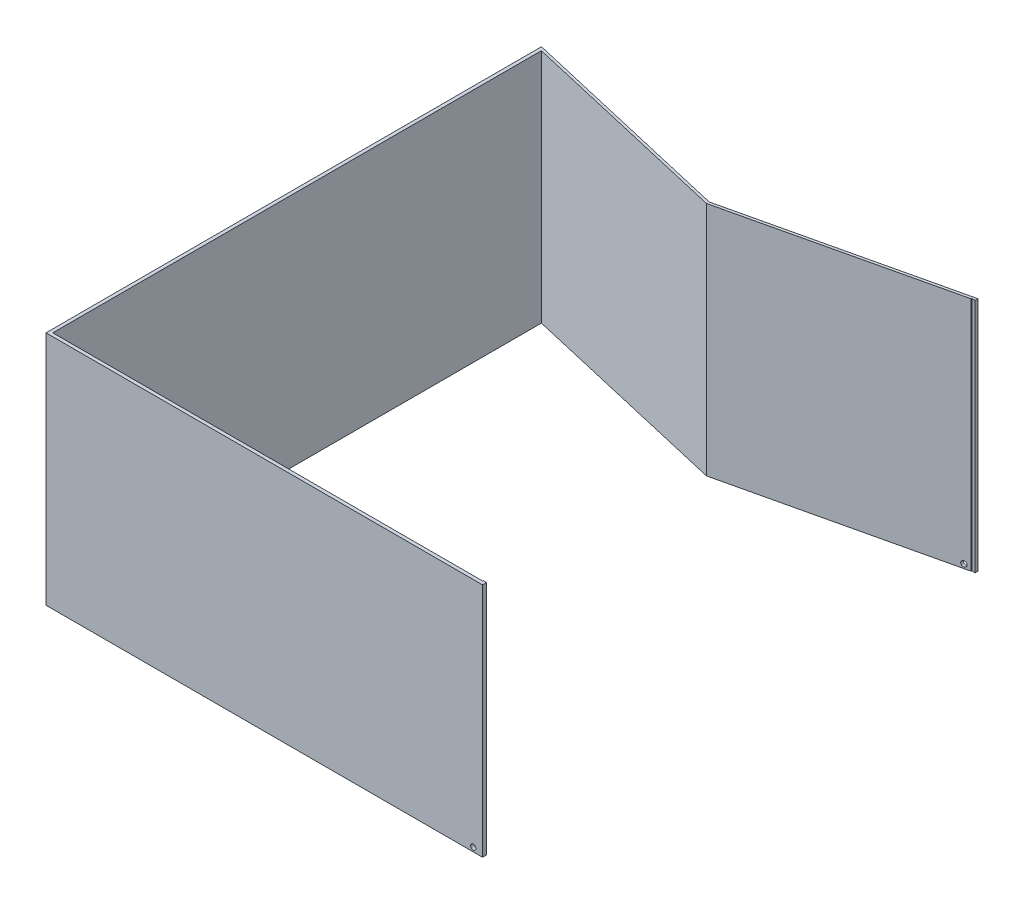
ISO-10303-21;
HEADER;
FILE_DESCRIPTION(('STEP AP214'),'2;1');
FILE_NAME('part.step','',(''),(''),'','','');
FILE_SCHEMA(('AUTOMOTIVE_DESIGN { 1 0 10303 214 1 1 1 1 }'));
ENDSEC;
DATA;
#1=APPLICATION_CONTEXT('core data for automotive mechanical design processes');
#2=APPLICATION_PROTOCOL_DEFINITION('international standard','automotive_design',2000,#1);
#3=PRODUCT_CONTEXT('',#1,'mechanical');
#4=PRODUCT('Part','Part','',(#3));
#5=PRODUCT_RELATED_PRODUCT_CATEGORY('part','',(#4));
#6=PRODUCT_DEFINITION_FORMATION('','',#4);
#7=PRODUCT_DEFINITION_CONTEXT('part definition',#1,'design');
#8=PRODUCT_DEFINITION('design','',#6,#7);
#9=PRODUCT_DEFINITION_SHAPE('','',#8);
#10=(LENGTH_UNIT() NAMED_UNIT(*) SI_UNIT(.MILLI.,.METRE.));
#11=(NAMED_UNIT(*) PLANE_ANGLE_UNIT() SI_UNIT($,.RADIAN.));
#12=(NAMED_UNIT(*) SI_UNIT($,.STERADIAN.) SOLID_ANGLE_UNIT());
#13=UNCERTAINTY_MEASURE_WITH_UNIT(LENGTH_MEASURE(1.E-05),#10,'distance_accuracy_value','');
#14=(GEOMETRIC_REPRESENTATION_CONTEXT(3) GLOBAL_UNCERTAINTY_ASSIGNED_CONTEXT((#13)) GLOBAL_UNIT_ASSIGNED_CONTEXT((#10,
#11,#12)) REPRESENTATION_CONTEXT('',''));
#15=CARTESIAN_POINT('',(0.,0.,0.));
#16=DIRECTION('',(0.,0.,1.));
#17=DIRECTION('',(1.,0.,0.));
#18=AXIS2_PLACEMENT_3D('',#15,#16,#17);
#19=CARTESIAN_POINT('',(328.93,355.6,373.38));
#20=DIRECTION('',(-1.,0.,0.));
#21=DIRECTION('',(0.,0.,1.));
#22=AXIS2_PLACEMENT_3D('',#19,#20,#21);
#23=PLANE('',#22);
#24=DIRECTION('',(0.,0.,-1.));
#25=VECTOR('',#24,1.);
#26=CARTESIAN_POINT('',(328.93,355.6,373.38));
#27=LINE('',#26,#25);
#28=CARTESIAN_POINT('',(328.93,355.6,-369.059218534318));
#29=VERTEX_POINT('',#28);
#30=CARTESIAN_POINT('',(328.93,355.6,-373.38));
#31=VERTEX_POINT('',#30);
#32=EDGE_CURVE('E213',#29,#31,#27,.T.);
#33=ORIENTED_EDGE('',*,*,#32,.F.);
#34=DIRECTION('',(0.,1.,0.));
#35=VECTOR('',#34,1.);
#36=CARTESIAN_POINT('',(328.93,0.,-369.059218534318));
#37=LINE('',#36,#35);
#38=CARTESIAN_POINT('',(328.93,0.,-369.059218534318));
#39=VERTEX_POINT('',#38);
#40=EDGE_CURVE('E149',#39,#29,#37,.T.);
#41=ORIENTED_EDGE('',*,*,#40,.F.);
#42=DIRECTION('',(0.,0.,-1.));
#43=VECTOR('',#42,1.);
#44=CARTESIAN_POINT('',(328.93,0.,373.38));
#45=LINE('',#44,#43);
#46=CARTESIAN_POINT('',(328.93,0.,-373.38));
#47=VERTEX_POINT('',#46);
#48=EDGE_CURVE('E160',#39,#47,#45,.T.);
#49=ORIENTED_EDGE('',*,*,#48,.T.);
#50=DIRECTION('',(0.,-1.,0.));
#51=VECTOR('',#50,1.);
#52=CARTESIAN_POINT('',(328.93,355.6,-373.38));
#53=LINE('',#52,#51);
#54=EDGE_CURVE('E217',#31,#47,#53,.T.);
#55=ORIENTED_EDGE('',*,*,#54,.F.);
#56=EDGE_LOOP('',(#33,#41,#49,#55));
#57=FACE_BOUND('',#56,.T.);
#58=ADVANCED_FACE('F35',(#57),#23,.F.);
#59=CARTESIAN_POINT('',(0.,355.6,0.));
#60=DIRECTION('',(0.,-1.,0.));
#61=DIRECTION('',(0.,0.,-1.));
#62=AXIS2_PLACEMENT_3D('',#59,#60,#61);
#63=PLANE('',#62);
#64=DIRECTION('',(-0.974200664409988,0.,0.225683551600769));
#65=VECTOR('',#64,1.);
#66=CARTESIAN_POINT('',(0.,355.6,-293.136734693878));
#67=LINE('',#66,#65);
#68=CARTESIAN_POINT('',(323.85,355.6,-368.159900717044));
#69=VERTEX_POINT('',#68);
#70=CARTESIAN_POINT('',(0.,355.6,-293.136734693878));
#71=VERTEX_POINT('',#70);
#72=EDGE_CURVE('E176',#69,#71,#67,.T.);
#73=ORIENTED_EDGE('',*,*,#72,.F.);
#74=DIRECTION('',(0.,0.,1.));
#75=VECTOR('',#74,1.);
#76=CARTESIAN_POINT('',(323.85,355.6,367.332930815479));
#77=LINE('',#76,#75);
#78=CARTESIAN_POINT('',(323.85,355.6,-369.059218534318));
#79=VERTEX_POINT('',#78);
#80=EDGE_CURVE('E275',#79,#69,#77,.T.);
#81=ORIENTED_EDGE('',*,*,#80,.F.);
#82=DIRECTION('',(1.,0.,0.));
#83=VECTOR('',#82,1.);
#84=CARTESIAN_POINT('',(-493.90592790515,355.6,-369.059218534318));
#85=LINE('',#84,#83);
#86=EDGE_CURVE('E155',#79,#29,#85,.T.);
#87=ORIENTED_EDGE('',*,*,#86,.T.);
#88=ORIENTED_EDGE('',*,*,#32,.T.);
#89=DIRECTION('',(-0.974200664409989,0.,0.22568355160077));
#90=VECTOR('',#89,1.);
#91=CARTESIAN_POINT('',(328.93,355.6,-373.38));
#92=LINE('',#91,#90);
#93=CARTESIAN_POINT('',(0.,355.6,-297.18));
#94=VERTEX_POINT('',#93);
#95=EDGE_CURVE('E203',#31,#94,#92,.T.);
#96=ORIENTED_EDGE('',*,*,#95,.T.);
#97=DIRECTION('',(-0.974200664409989,0.,-0.22568355160077));
#98=VECTOR('',#97,1.);
#99=CARTESIAN_POINT('',(0.,355.6,-297.18));
#100=LINE('',#99,#98);
#101=CARTESIAN_POINT('',(-328.93,355.6,-373.38));
#102=VERTEX_POINT('',#101);
#103=EDGE_CURVE('E206',#94,#102,#100,.T.);
#104=ORIENTED_EDGE('',*,*,#103,.T.);
#105=DIRECTION('',(0.,0.,1.));
#106=VECTOR('',#105,1.);
#107=CARTESIAN_POINT('',(-328.93,355.6,373.38));
#108=LINE('',#107,#106);
#109=CARTESIAN_POINT('',(-328.93,355.6,373.38));
#110=VERTEX_POINT('',#109);
#111=EDGE_CURVE('E209',#102,#110,#108,.T.);
#112=ORIENTED_EDGE('',*,*,#111,.T.);
#113=DIRECTION('',(1.,0.,0.));
#114=VECTOR('',#113,1.);
#115=CARTESIAN_POINT('',(-328.93,355.6,373.38));
#116=LINE('',#115,#114);
#117=CARTESIAN_POINT('',(328.93,355.6,373.38));
#118=VERTEX_POINT('',#117);
#119=EDGE_CURVE('E211',#110,#118,#116,.T.);
#120=ORIENTED_EDGE('',*,*,#119,.T.);
#121=CARTESIAN_POINT('',(328.93,355.6,367.332930815479));
#122=VERTEX_POINT('',#121);
#123=EDGE_CURVE('E214',#118,#122,#27,.T.);
#124=ORIENTED_EDGE('',*,*,#123,.T.);
#125=DIRECTION('',(1.,0.,0.));
#126=VECTOR('',#125,1.);
#127=CARTESIAN_POINT('',(-493.90592790515,355.6,367.332930815479));
#128=LINE('',#127,#126);
#129=CARTESIAN_POINT('',(323.85,355.6,367.332930815479));
#130=VERTEX_POINT('',#129);
#131=EDGE_CURVE('E260',#130,#122,#128,.T.);
#132=ORIENTED_EDGE('',*,*,#131,.F.);
#133=DIRECTION('',(0.,0.,-1.));
#134=VECTOR('',#133,1.);
#135=CARTESIAN_POINT('',(323.85,355.6,368.3));
#136=LINE('',#135,#134);
#137=CARTESIAN_POINT('',(323.85,355.6,368.3));
#138=VERTEX_POINT('',#137);
#139=EDGE_CURVE('E173',#138,#130,#136,.T.);
#140=ORIENTED_EDGE('',*,*,#139,.F.);
#141=DIRECTION('',(1.,0.,0.));
#142=VECTOR('',#141,1.);
#143=CARTESIAN_POINT('',(-323.85,355.6,368.3));
#144=LINE('',#143,#142);
#145=CARTESIAN_POINT('',(-323.85,355.6,368.3));
#146=VERTEX_POINT('',#145);
#147=EDGE_CURVE('E170',#146,#138,#144,.T.);
#148=ORIENTED_EDGE('',*,*,#147,.F.);
#149=DIRECTION('',(0.,0.,1.));
#150=VECTOR('',#149,1.);
#151=CARTESIAN_POINT('',(-323.85,355.6,368.3));
#152=LINE('',#151,#150);
#153=CARTESIAN_POINT('',(-323.85,355.6,-368.159900717044));
#154=VERTEX_POINT('',#153);
#155=EDGE_CURVE('E168',#154,#146,#152,.T.);
#156=ORIENTED_EDGE('',*,*,#155,.F.);
#157=DIRECTION('',(-0.974200664409988,0.,-0.225683551600769));
#158=VECTOR('',#157,1.);
#159=CARTESIAN_POINT('',(-323.85,355.6,-368.159900717044));
#160=LINE('',#159,#158);
#161=EDGE_CURVE('E178',#71,#154,#160,.T.);
#162=ORIENTED_EDGE('',*,*,#161,.F.);
#163=EDGE_LOOP('',(#73,#81,#87,#88,#96,#104,#112,#120,#124,#132,#140,#148,#156,#162));
#164=FACE_BOUND('',#163,.T.);
#165=ADVANCED_FACE('F258',(#164),#63,.F.);
#166=CARTESIAN_POINT('',(0.,0.,0.));
#167=DIRECTION('',(0.,-1.,0.));
#168=DIRECTION('',(0.,0.,-1.));
#169=AXIS2_PLACEMENT_3D('',#166,#167,#168);
#170=PLANE('',#169);
#171=DIRECTION('',(0.,0.,-1.));
#172=VECTOR('',#171,1.);
#173=CARTESIAN_POINT('',(323.85,0.,367.332930815479));
#174=LINE('',#173,#172);
#175=CARTESIAN_POINT('',(323.85,0.,-368.159900717044));
#176=VERTEX_POINT('',#175);
#177=CARTESIAN_POINT('',(323.85,0.,-369.059218534318));
#178=VERTEX_POINT('',#177);
#179=EDGE_CURVE('E137',#176,#178,#174,.T.);
#180=ORIENTED_EDGE('',*,*,#179,.F.);
#181=DIRECTION('',(-0.974200664409988,0.,0.225683551600769));
#182=VECTOR('',#181,1.);
#183=CARTESIAN_POINT('',(0.,0.,-293.136734693878));
#184=LINE('',#183,#182);
#185=CARTESIAN_POINT('',(0.,0.,-293.136734693878));
#186=VERTEX_POINT('',#185);
#187=EDGE_CURVE('E189',#176,#186,#184,.T.);
#188=ORIENTED_EDGE('',*,*,#187,.T.);
#189=DIRECTION('',(-0.974200664409988,0.,-0.225683551600769));
#190=VECTOR('',#189,1.);
#191=CARTESIAN_POINT('',(-323.85,0.,-368.159900717044));
#192=LINE('',#191,#190);
#193=CARTESIAN_POINT('',(-323.85,0.,-368.159900717043));
#194=VERTEX_POINT('',#193);
#195=EDGE_CURVE('E171',#186,#194,#192,.T.);
#196=ORIENTED_EDGE('',*,*,#195,.T.);
#197=DIRECTION('',(0.,0.,1.));
#198=VECTOR('',#197,1.);
#199=CARTESIAN_POINT('',(-323.85,0.,368.3));
#200=LINE('',#199,#198);
#201=CARTESIAN_POINT('',(-323.85,0.,368.3));
#202=VERTEX_POINT('',#201);
#203=EDGE_CURVE('E166',#194,#202,#200,.T.);
#204=ORIENTED_EDGE('',*,*,#203,.T.);
#205=DIRECTION('',(1.,0.,0.));
#206=VECTOR('',#205,1.);
#207=CARTESIAN_POINT('',(-323.85,0.,368.3));
#208=LINE('',#207,#206);
#209=CARTESIAN_POINT('',(323.85,0.,368.3));
#210=VERTEX_POINT('',#209);
#211=EDGE_CURVE('E183',#202,#210,#208,.T.);
#212=ORIENTED_EDGE('',*,*,#211,.T.);
#213=DIRECTION('',(0.,0.,-1.));
#214=VECTOR('',#213,1.);
#215=CARTESIAN_POINT('',(323.85,0.,368.3));
#216=LINE('',#215,#214);
#217=CARTESIAN_POINT('',(323.85,0.,367.332930815479));
#218=VERTEX_POINT('',#217);
#219=EDGE_CURVE('E186',#210,#218,#216,.T.);
#220=ORIENTED_EDGE('',*,*,#219,.T.);
#221=DIRECTION('',(1.,0.,0.));
#222=VECTOR('',#221,1.);
#223=CARTESIAN_POINT('',(-493.90592790515,0.,367.332930815479));
#224=LINE('',#223,#222);
#225=CARTESIAN_POINT('',(328.93,0.,367.332930815479));
#226=VERTEX_POINT('',#225);
#227=EDGE_CURVE('E51',#218,#226,#224,.T.);
#228=ORIENTED_EDGE('',*,*,#227,.T.);
#229=CARTESIAN_POINT('',(328.93,0.,373.38));
#230=VERTEX_POINT('',#229);
#231=EDGE_CURVE('E207',#230,#226,#45,.T.);
#232=ORIENTED_EDGE('',*,*,#231,.F.);
#233=DIRECTION('',(1.,0.,0.));
#234=VECTOR('',#233,1.);
#235=CARTESIAN_POINT('',(-328.93,0.,373.38));
#236=LINE('',#235,#234);
#237=CARTESIAN_POINT('',(-328.93,0.,373.38));
#238=VERTEX_POINT('',#237);
#239=EDGE_CURVE('E224',#238,#230,#236,.T.);
#240=ORIENTED_EDGE('',*,*,#239,.F.);
#241=DIRECTION('',(0.,0.,1.));
#242=VECTOR('',#241,1.);
#243=CARTESIAN_POINT('',(-328.93,0.,373.38));
#244=LINE('',#243,#242);
#245=CARTESIAN_POINT('',(-328.93,0.,-373.38));
#246=VERTEX_POINT('',#245);
#247=EDGE_CURVE('E222',#246,#238,#244,.T.);
#248=ORIENTED_EDGE('',*,*,#247,.F.);
#249=DIRECTION('',(-0.974200664409989,0.,-0.22568355160077));
#250=VECTOR('',#249,1.);
#251=CARTESIAN_POINT('',(0.,0.,-297.18));
#252=LINE('',#251,#250);
#253=CARTESIAN_POINT('',(0.,0.,-297.18));
#254=VERTEX_POINT('',#253);
#255=EDGE_CURVE('E220',#254,#246,#252,.T.);
#256=ORIENTED_EDGE('',*,*,#255,.F.);
#257=DIRECTION('',(-0.974200664409989,0.,0.22568355160077));
#258=VECTOR('',#257,1.);
#259=CARTESIAN_POINT('',(328.93,0.,-373.38));
#260=LINE('',#259,#258);
#261=EDGE_CURVE('E202',#47,#254,#260,.T.);
#262=ORIENTED_EDGE('',*,*,#261,.F.);
#263=ORIENTED_EDGE('',*,*,#48,.F.);
#264=DIRECTION('',(1.,0.,0.));
#265=VECTOR('',#264,1.);
#266=CARTESIAN_POINT('',(-493.90592790515,0.,-369.059218534318));
#267=LINE('',#266,#265);
#268=EDGE_CURVE('E148',#178,#39,#267,.T.);
#269=ORIENTED_EDGE('',*,*,#268,.F.);
#270=EDGE_LOOP('',(#180,#188,#196,#204,#212,#220,#228,#232,#240,#248,#256,#262,#263,#269));
#271=FACE_BOUND('',#270,.T.);
#272=ADVANCED_FACE('F158',(#271),#170,.T.);
#273=CARTESIAN_POINT('',(328.93,355.6,-373.38));
#274=DIRECTION('',(0.225683551600769,0.,0.974200664409988));
#275=DIRECTION('',(0.974200664409988,0.,-0.22568355160077));
#276=AXIS2_PLACEMENT_3D('',#273,#274,#275);
#277=PLANE('',#276);
#278=CARTESIAN_POINT('',(315.000794764984,6.29754109824887,-370.153157088413));
#279=DIRECTION('',(0.225683551600769,0.,0.974200664409988));
#280=DIRECTION('',(-0.974200664409988,0.,0.22568355160077));
#281=AXIS2_PLACEMENT_3D('',#278,#279,#280);
#282=ELLIPSE('',#281,4.06733452845649,3.9624);
#283=CARTESIAN_POINT('',(311.038394764984,6.29754109824887,-369.235226586482));
#284=VERTEX_POINT('',#283);
#285=EDGE_CURVE('E333',#284,#284,#282,.F.);
#286=ORIENTED_EDGE('',*,*,#285,.F.);
#287=EDGE_LOOP('',(#286));
#288=FACE_BOUND('',#287,.T.);
#289=ORIENTED_EDGE('',*,*,#261,.T.);
#290=DIRECTION('',(0.,-1.,0.));
#291=VECTOR('',#290,1.);
#292=CARTESIAN_POINT('',(0.,355.6,-297.18));
#293=LINE('',#292,#291);
#294=EDGE_CURVE('E11',#94,#254,#293,.T.);
#295=ORIENTED_EDGE('',*,*,#294,.F.);
#296=ORIENTED_EDGE('',*,*,#95,.F.);
#297=ORIENTED_EDGE('',*,*,#54,.T.);
#298=EDGE_LOOP('',(#289,#295,#296,#297));
#299=FACE_BOUND('',#298,.T.);
#300=ADVANCED_FACE('F37',(#288,#299),#277,.F.);
#301=CARTESIAN_POINT('',(0.,355.6,-297.18));
#302=DIRECTION('',(-0.225683551600769,0.,0.974200664409988));
#303=DIRECTION('',(0.974200664409988,0.,0.22568355160077));
#304=AXIS2_PLACEMENT_3D('',#301,#302,#303);
#305=PLANE('',#304);
#306=ORIENTED_EDGE('',*,*,#255,.T.);
#307=DIRECTION('',(0.,-1.,0.));
#308=VECTOR('',#307,1.);
#309=CARTESIAN_POINT('',(-328.93,355.6,-373.38));
#310=LINE('',#309,#308);
#311=EDGE_CURVE('E44',#102,#246,#310,.T.);
#312=ORIENTED_EDGE('',*,*,#311,.F.);
#313=ORIENTED_EDGE('',*,*,#103,.F.);
#314=ORIENTED_EDGE('',*,*,#294,.T.);
#315=EDGE_LOOP('',(#306,#312,#313,#314));
#316=FACE_BOUND('',#315,.T.);
#317=ADVANCED_FACE('F263',(#316),#305,.F.);
#318=CARTESIAN_POINT('',(-328.93,355.6,373.38));
#319=DIRECTION('',(1.,0.,0.));
#320=DIRECTION('',(0.,0.,-1.));
#321=AXIS2_PLACEMENT_3D('',#318,#319,#320);
#322=PLANE('',#321);
#323=ORIENTED_EDGE('',*,*,#247,.T.);
#324=DIRECTION('',(0.,-1.,0.));
#325=VECTOR('',#324,1.);
#326=CARTESIAN_POINT('',(-328.93,355.6,373.38));
#327=LINE('',#326,#325);
#328=EDGE_CURVE('E233',#110,#238,#327,.T.);
#329=ORIENTED_EDGE('',*,*,#328,.F.);
#330=ORIENTED_EDGE('',*,*,#111,.F.);
#331=ORIENTED_EDGE('',*,*,#311,.T.);
#332=EDGE_LOOP('',(#323,#329,#330,#331));
#333=FACE_BOUND('',#332,.T.);
#334=ADVANCED_FACE('F241',(#333),#322,.F.);
#335=CARTESIAN_POINT('',(-328.93,355.6,373.38));
#336=DIRECTION('',(0.,0.,-1.));
#337=DIRECTION('',(-1.,0.,0.));
#338=AXIS2_PLACEMENT_3D('',#335,#336,#337);
#339=PLANE('',#338);
#340=CARTESIAN_POINT('',(315.000794764984,6.29754109824887,373.38));
#341=DIRECTION('',(0.,0.,1.));
#342=DIRECTION('',(1.,0.,0.));
#343=AXIS2_PLACEMENT_3D('',#340,#341,#342);
#344=CIRCLE('',#343,3.9624);
#345=CARTESIAN_POINT('',(318.963194764984,6.29754109824887,373.38));
#346=VERTEX_POINT('',#345);
#347=EDGE_CURVE('E335',#346,#346,#344,.T.);
#348=ORIENTED_EDGE('',*,*,#347,.F.);
#349=EDGE_LOOP('',(#348));
#350=FACE_BOUND('',#349,.T.);
#351=ORIENTED_EDGE('',*,*,#239,.T.);
#352=DIRECTION('',(0.,-1.,0.));
#353=VECTOR('',#352,1.);
#354=CARTESIAN_POINT('',(328.93,355.6,373.38));
#355=LINE('',#354,#353);
#356=EDGE_CURVE('E230',#118,#230,#355,.T.);
#357=ORIENTED_EDGE('',*,*,#356,.F.);
#358=ORIENTED_EDGE('',*,*,#119,.F.);
#359=ORIENTED_EDGE('',*,*,#328,.T.);
#360=EDGE_LOOP('',(#351,#357,#358,#359));
#361=FACE_BOUND('',#360,.T.);
#362=ADVANCED_FACE('F248',(#350,#361),#339,.F.);
#363=ORIENTED_EDGE('',*,*,#231,.T.);
#364=DIRECTION('',(0.,-1.,0.));
#365=VECTOR('',#364,1.);
#366=CARTESIAN_POINT('',(328.93,0.,367.332930815479));
#367=LINE('',#366,#365);
#368=EDGE_CURVE('E254',#122,#226,#367,.T.);
#369=ORIENTED_EDGE('',*,*,#368,.F.);
#370=ORIENTED_EDGE('',*,*,#123,.F.);
#371=ORIENTED_EDGE('',*,*,#356,.T.);
#372=EDGE_LOOP('',(#363,#369,#370,#371));
#373=FACE_BOUND('',#372,.T.);
#374=ADVANCED_FACE('F252',(#373),#23,.F.);
#375=CARTESIAN_POINT('',(-323.85,355.6,368.3));
#376=DIRECTION('',(1.,0.,0.));
#377=DIRECTION('',(0.,0.,-1.));
#378=AXIS2_PLACEMENT_3D('',#375,#376,#377);
#379=PLANE('',#378);
#380=ORIENTED_EDGE('',*,*,#203,.F.);
#381=DIRECTION('',(0.,-1.,0.));
#382=VECTOR('',#381,1.);
#383=CARTESIAN_POINT('',(-323.85,355.6,-368.159900717044));
#384=LINE('',#383,#382);
#385=EDGE_CURVE('E180',#154,#194,#384,.T.);
#386=ORIENTED_EDGE('',*,*,#385,.F.);
#387=ORIENTED_EDGE('',*,*,#155,.T.);
#388=DIRECTION('',(0.,-1.,0.));
#389=VECTOR('',#388,1.);
#390=CARTESIAN_POINT('',(-323.85,355.6,368.3));
#391=LINE('',#390,#389);
#392=EDGE_CURVE('E199',#146,#202,#391,.T.);
#393=ORIENTED_EDGE('',*,*,#392,.T.);
#394=EDGE_LOOP('',(#380,#386,#387,#393));
#395=FACE_BOUND('',#394,.T.);
#396=ADVANCED_FACE('F286',(#395),#379,.T.);
#397=CARTESIAN_POINT('',(-323.85,355.6,368.3));
#398=DIRECTION('',(0.,0.,-1.));
#399=DIRECTION('',(-1.,0.,0.));
#400=AXIS2_PLACEMENT_3D('',#397,#398,#399);
#401=PLANE('',#400);
#402=CARTESIAN_POINT('',(315.000794764984,6.29754109824887,368.3));
#403=DIRECTION('',(0.,0.,-1.));
#404=DIRECTION('',(-1.,0.,0.));
#405=AXIS2_PLACEMENT_3D('',#402,#403,#404);
#406=CIRCLE('',#405,3.9624);
#407=CARTESIAN_POINT('',(311.038394764984,6.29754109824887,368.3));
#408=VERTEX_POINT('',#407);
#409=EDGE_CURVE('E269',#408,#408,#406,.T.);
#410=ORIENTED_EDGE('',*,*,#409,.F.);
#411=EDGE_LOOP('',(#410));
#412=FACE_BOUND('',#411,.T.);
#413=ORIENTED_EDGE('',*,*,#211,.F.);
#414=ORIENTED_EDGE('',*,*,#392,.F.);
#415=ORIENTED_EDGE('',*,*,#147,.T.);
#416=DIRECTION('',(0.,-1.,0.));
#417=VECTOR('',#416,1.);
#418=CARTESIAN_POINT('',(323.85,355.6,368.3));
#419=LINE('',#418,#417);
#420=EDGE_CURVE('E197',#138,#210,#419,.T.);
#421=ORIENTED_EDGE('',*,*,#420,.T.);
#422=EDGE_LOOP('',(#413,#414,#415,#421));
#423=FACE_BOUND('',#422,.T.);
#424=ADVANCED_FACE('F283',(#412,#423),#401,.T.);
#425=CARTESIAN_POINT('',(323.85,355.6,368.3));
#426=DIRECTION('',(-1.,0.,0.));
#427=DIRECTION('',(0.,0.,1.));
#428=AXIS2_PLACEMENT_3D('',#425,#426,#427);
#429=PLANE('',#428);
#430=DIRECTION('',(0.,-1.,0.));
#431=VECTOR('',#430,1.);
#432=CARTESIAN_POINT('',(323.85,0.,367.332930815479));
#433=LINE('',#432,#431);
#434=EDGE_CURVE('E167',#130,#218,#433,.T.);
#435=ORIENTED_EDGE('',*,*,#434,.T.);
#436=ORIENTED_EDGE('',*,*,#219,.F.);
#437=ORIENTED_EDGE('',*,*,#420,.F.);
#438=ORIENTED_EDGE('',*,*,#139,.T.);
#439=EDGE_LOOP('',(#435,#436,#437,#438));
#440=FACE_BOUND('',#439,.T.);
#441=ADVANCED_FACE('F279',(#440),#429,.T.);
#442=CARTESIAN_POINT('',(0.,355.6,-293.136734693878));
#443=DIRECTION('',(0.225683551600769,0.,0.974200664409988));
#444=DIRECTION('',(0.974200664409988,0.,-0.225683551600769));
#445=AXIS2_PLACEMENT_3D('',#442,#443,#444);
#446=PLANE('',#445);
#447=CARTESIAN_POINT('',(315.000794764984,6.29754109824887,-366.109891782291));
#448=DIRECTION('',(0.225683551600769,0.,0.974200664409988));
#449=DIRECTION('',(-0.974200664409988,0.,0.225683551600769));
#450=AXIS2_PLACEMENT_3D('',#447,#448,#449);
#451=ELLIPSE('',#450,4.06733452845649,3.9624);
#452=CARTESIAN_POINT('',(311.038394764984,6.29754109824887,-365.19196128036));
#453=VERTEX_POINT('',#452);
#454=EDGE_CURVE('E39',#453,#453,#451,.T.);
#455=ORIENTED_EDGE('',*,*,#454,.F.);
#456=EDGE_LOOP('',(#455));
#457=FACE_BOUND('',#456,.T.);
#458=ORIENTED_EDGE('',*,*,#187,.F.);
#459=DIRECTION('',(0.,-1.,0.));
#460=VECTOR('',#459,1.);
#461=CARTESIAN_POINT('',(323.85,355.6,-368.159900717044));
#462=LINE('',#461,#460);
#463=EDGE_CURVE('E143',#69,#176,#462,.T.);
#464=ORIENTED_EDGE('',*,*,#463,.F.);
#465=ORIENTED_EDGE('',*,*,#72,.T.);
#466=DIRECTION('',(0.,-1.,0.));
#467=VECTOR('',#466,1.);
#468=CARTESIAN_POINT('',(0.,355.6,-293.136734693878));
#469=LINE('',#468,#467);
#470=EDGE_CURVE('E59',#71,#186,#469,.T.);
#471=ORIENTED_EDGE('',*,*,#470,.T.);
#472=EDGE_LOOP('',(#458,#464,#465,#471));
#473=FACE_BOUND('',#472,.T.);
#474=ADVANCED_FACE('F292',(#457,#473),#446,.T.);
#475=CARTESIAN_POINT('',(-323.85,355.6,-368.159900717044));
#476=DIRECTION('',(-0.225683551600769,0.,0.974200664409988));
#477=DIRECTION('',(0.974200664409989,0.,0.225683551600769));
#478=AXIS2_PLACEMENT_3D('',#475,#476,#477);
#479=PLANE('',#478);
#480=ORIENTED_EDGE('',*,*,#195,.F.);
#481=ORIENTED_EDGE('',*,*,#470,.F.);
#482=ORIENTED_EDGE('',*,*,#161,.T.);
#483=ORIENTED_EDGE('',*,*,#385,.T.);
#484=EDGE_LOOP('',(#480,#481,#482,#483));
#485=FACE_BOUND('',#484,.T.);
#486=ADVANCED_FACE('F290',(#485),#479,.T.);
#487=CARTESIAN_POINT('',(323.85,355.6,368.3));
#488=DIRECTION('',(-1.,0.,0.));
#489=DIRECTION('',(0.,0.,1.));
#490=AXIS2_PLACEMENT_3D('',#487,#488,#489);
#491=PLANE('',#490);
#492=ORIENTED_EDGE('',*,*,#463,.T.);
#493=ORIENTED_EDGE('',*,*,#179,.T.);
#494=DIRECTION('',(0.,1.,0.));
#495=VECTOR('',#494,1.);
#496=CARTESIAN_POINT('',(323.85,0.,-369.059218534318));
#497=LINE('',#496,#495);
#498=EDGE_CURVE('E140',#178,#79,#497,.T.);
#499=ORIENTED_EDGE('',*,*,#498,.T.);
#500=ORIENTED_EDGE('',*,*,#80,.T.);
#501=EDGE_LOOP('',(#492,#493,#499,#500));
#502=FACE_BOUND('',#501,.T.);
#503=ADVANCED_FACE('F139',(#502),#491,.F.);
#504=CARTESIAN_POINT('',(-493.90592790515,0.,-369.059218534318));
#505=DIRECTION('',(0.,0.,-1.));
#506=DIRECTION('',(-1.,0.,0.));
#507=AXIS2_PLACEMENT_3D('',#504,#505,#506);
#508=PLANE('',#507);
#509=ORIENTED_EDGE('',*,*,#268,.T.);
#510=ORIENTED_EDGE('',*,*,#40,.T.);
#511=ORIENTED_EDGE('',*,*,#86,.F.);
#512=ORIENTED_EDGE('',*,*,#498,.F.);
#513=EDGE_LOOP('',(#509,#510,#511,#512));
#514=FACE_BOUND('',#513,.T.);
#515=ADVANCED_FACE('F152',(#514),#508,.F.);
#516=CARTESIAN_POINT('',(-493.90592790515,0.,367.332930815479));
#517=DIRECTION('',(0.,0.,1.));
#518=DIRECTION('',(1.,0.,0.));
#519=AXIS2_PLACEMENT_3D('',#516,#517,#518);
#520=PLANE('',#519);
#521=ORIENTED_EDGE('',*,*,#131,.T.);
#522=ORIENTED_EDGE('',*,*,#368,.T.);
#523=ORIENTED_EDGE('',*,*,#227,.F.);
#524=ORIENTED_EDGE('',*,*,#434,.F.);
#525=EDGE_LOOP('',(#521,#522,#523,#524));
#526=FACE_BOUND('',#525,.T.);
#527=ADVANCED_FACE('F276',(#526),#520,.F.);
#528=CARTESIAN_POINT('',(315.000794764984,6.29754109824887,-381.508916560811));
#529=DIRECTION('',(0.,0.,1.));
#530=DIRECTION('',(1.,0.,0.));
#531=AXIS2_PLACEMENT_3D('',#528,#529,#530);
#532=CYLINDRICAL_SURFACE('',#531,3.9624);
#533=ORIENTED_EDGE('',*,*,#454,.T.);
#534=EDGE_LOOP('',(#533));
#535=FACE_BOUND('',#534,.T.);
#536=ORIENTED_EDGE('',*,*,#285,.T.);
#537=EDGE_LOOP('',(#536));
#538=FACE_BOUND('',#537,.T.);
#539=ADVANCED_FACE('F342',(#535,#538),#532,.F.);
#540=ORIENTED_EDGE('',*,*,#409,.T.);
#541=EDGE_LOOP('',(#540));
#542=FACE_BOUND('',#541,.T.);
#543=ORIENTED_EDGE('',*,*,#347,.T.);
#544=EDGE_LOOP('',(#543));
#545=FACE_BOUND('',#544,.T.);
#546=ADVANCED_FACE('F340',(#542,#545),#532,.F.);
#547=CLOSED_SHELL('',(#58,#165,#272,#300,#317,#334,#362,#374,#396,#424,#441,#474,#486,#503,#515,
#527,#539,#546));
#548=MANIFOLD_SOLID_BREP('B2',#547);
#549=ADVANCED_BREP_SHAPE_REPRESENTATION('',(#18,#548),#14);
#550=SHAPE_DEFINITION_REPRESENTATION(#9,#549);
ENDSEC;
END-ISO-10303-21;
